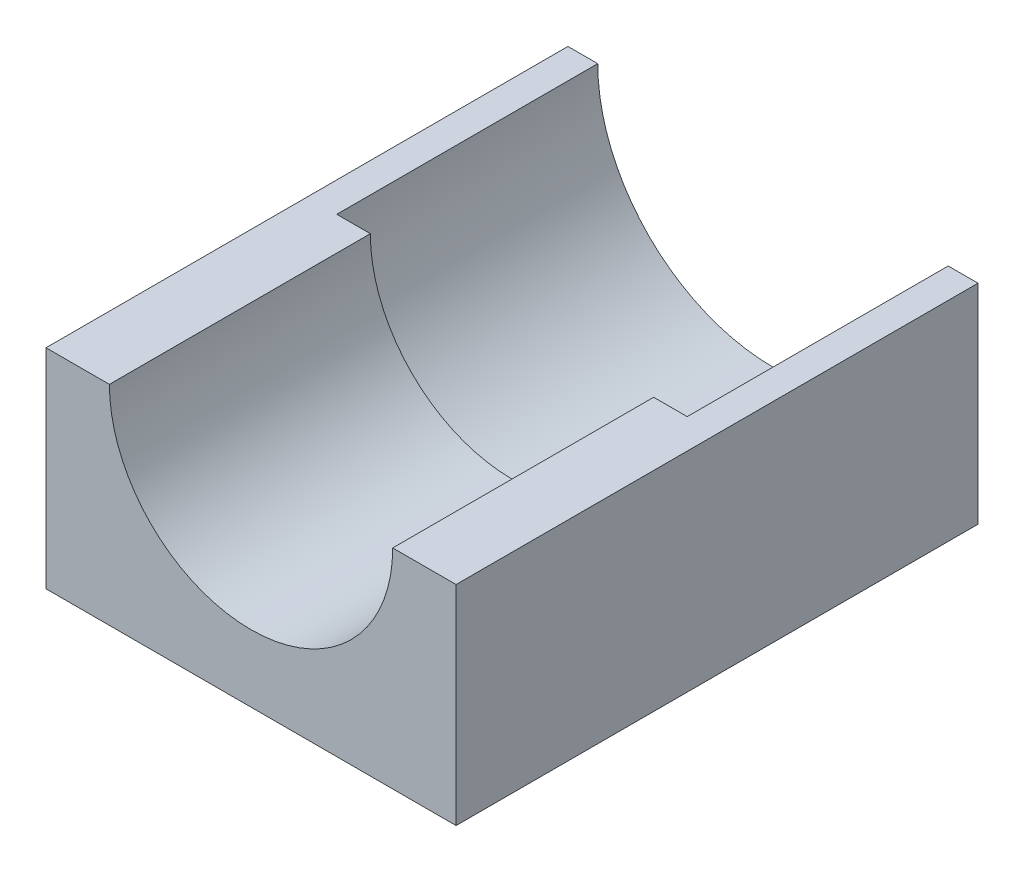
ISO-10303-21;
HEADER;
FILE_DESCRIPTION(('STEP AP214'),'2;1');
FILE_NAME('part.step','',(''),(''),'','','');
FILE_SCHEMA(('AUTOMOTIVE_DESIGN { 1 0 10303 214 1 1 1 1 }'));
ENDSEC;
DATA;
#1=APPLICATION_CONTEXT('core data for automotive mechanical design processes');
#2=APPLICATION_PROTOCOL_DEFINITION('international standard','automotive_design',2000,#1);
#3=PRODUCT_CONTEXT('',#1,'mechanical');
#4=PRODUCT('Part','Part','',(#3));
#5=PRODUCT_RELATED_PRODUCT_CATEGORY('part','',(#4));
#6=PRODUCT_DEFINITION_FORMATION('','',#4);
#7=PRODUCT_DEFINITION_CONTEXT('part definition',#1,'design');
#8=PRODUCT_DEFINITION('design','',#6,#7);
#9=PRODUCT_DEFINITION_SHAPE('','',#8);
#10=(LENGTH_UNIT() NAMED_UNIT(*) SI_UNIT(.MILLI.,.METRE.));
#11=(NAMED_UNIT(*) PLANE_ANGLE_UNIT() SI_UNIT($,.RADIAN.));
#12=(NAMED_UNIT(*) SI_UNIT($,.STERADIAN.) SOLID_ANGLE_UNIT());
#13=UNCERTAINTY_MEASURE_WITH_UNIT(LENGTH_MEASURE(1.E-05),#10,'distance_accuracy_value','');
#14=(GEOMETRIC_REPRESENTATION_CONTEXT(3) GLOBAL_UNCERTAINTY_ASSIGNED_CONTEXT((#13)) GLOBAL_UNIT_ASSIGNED_CONTEXT((#10,
#11,#12)) REPRESENTATION_CONTEXT('',''));
#15=CARTESIAN_POINT('',(0.,0.,0.));
#16=DIRECTION('',(0.,0.,1.));
#17=DIRECTION('',(1.,0.,0.));
#18=AXIS2_PLACEMENT_3D('',#15,#16,#17);
#19=CARTESIAN_POINT('',(72.2489418291473,15.9322548609087,35.));
#20=DIRECTION('',(0.,0.,-1.));
#21=DIRECTION('',(-1.,0.,0.));
#22=AXIS2_PLACEMENT_3D('',#19,#20,#21);
#23=CYLINDRICAL_SURFACE('',#22,23.5);
#24=CARTESIAN_POINT('',(72.2489418291473,15.9322548609087,0.));
#25=DIRECTION('',(0.,0.,-1.));
#26=DIRECTION('',(-1.,0.,0.));
#27=AXIS2_PLACEMENT_3D('',#24,#25,#26);
#28=CIRCLE('',#27,23.5);
#29=CARTESIAN_POINT('',(95.7489418291473,15.9322548609085,0.));
#30=VERTEX_POINT('',#29);
#31=CARTESIAN_POINT('',(48.7489418291473,15.9322548609087,0.));
#32=VERTEX_POINT('',#31);
#33=EDGE_CURVE('E99',#30,#32,#28,.T.);
#34=ORIENTED_EDGE('',*,*,#33,.T.);
#35=DIRECTION('',(0.,0.,-1.));
#36=VECTOR('',#35,1.);
#37=CARTESIAN_POINT('',(48.7489418291473,15.9322548609087,35.));
#38=LINE('',#37,#36);
#39=CARTESIAN_POINT('',(48.7489418291473,15.9322548609087,35.));
#40=VERTEX_POINT('',#39);
#41=EDGE_CURVE('E11',#40,#32,#38,.T.);
#42=ORIENTED_EDGE('',*,*,#41,.F.);
#43=CARTESIAN_POINT('',(72.2489418291473,15.9322548609087,35.));
#44=DIRECTION('',(0.,0.,-1.));
#45=DIRECTION('',(-1.,0.,0.));
#46=AXIS2_PLACEMENT_3D('',#43,#44,#45);
#47=CIRCLE('',#46,23.5);
#48=CARTESIAN_POINT('',(95.7489418291473,15.9322548609085,35.));
#49=VERTEX_POINT('',#48);
#50=EDGE_CURVE('E100',#49,#40,#47,.T.);
#51=ORIENTED_EDGE('',*,*,#50,.F.);
#52=DIRECTION('',(0.,0.,-1.));
#53=VECTOR('',#52,1.);
#54=CARTESIAN_POINT('',(95.7489418291473,15.9322548609085,35.));
#55=LINE('',#54,#53);
#56=EDGE_CURVE('E52',#49,#30,#55,.T.);
#57=ORIENTED_EDGE('',*,*,#56,.T.);
#58=EDGE_LOOP('',(#34,#42,#51,#57));
#59=FACE_BOUND('',#58,.T.);
#60=ADVANCED_FACE('F37',(#59),#23,.F.);
#61=CARTESIAN_POINT('',(48.7489418291473,15.9322548609087,35.));
#62=DIRECTION('',(0.,-1.,0.));
#63=DIRECTION('',(0.,0.,-1.));
#64=AXIS2_PLACEMENT_3D('',#61,#62,#63);
#65=PLANE('',#64);
#66=DIRECTION('',(-1.,0.,0.));
#67=VECTOR('',#66,1.);
#68=CARTESIAN_POINT('',(48.7489418291473,15.9322548609087,0.));
#69=LINE('',#68,#67);
#70=CARTESIAN_POINT('',(44.7489418291473,15.9322548609087,0.));
#71=VERTEX_POINT('',#70);
#72=EDGE_CURVE('E124',#32,#71,#69,.T.);
#73=ORIENTED_EDGE('',*,*,#72,.T.);
#74=DIRECTION('',(0.,0.,-1.));
#75=VECTOR('',#74,1.);
#76=CARTESIAN_POINT('',(44.7489418291473,15.9322548609087,35.));
#77=LINE('',#76,#75);
#78=CARTESIAN_POINT('',(44.7489418291473,15.9322548609087,70.));
#79=VERTEX_POINT('',#78);
#80=EDGE_CURVE('E45',#79,#71,#77,.T.);
#81=ORIENTED_EDGE('',*,*,#80,.F.);
#82=DIRECTION('',(-1.,0.,0.));
#83=VECTOR('',#82,1.);
#84=CARTESIAN_POINT('',(44.7489418291473,15.9322548609087,70.));
#85=LINE('',#84,#83);
#86=CARTESIAN_POINT('',(53.2489418291473,15.9322548609087,70.));
#87=VERTEX_POINT('',#86);
#88=EDGE_CURVE('E151',#87,#79,#85,.T.);
#89=ORIENTED_EDGE('',*,*,#88,.F.);
#90=DIRECTION('',(0.,0.,-1.));
#91=VECTOR('',#90,1.);
#92=CARTESIAN_POINT('',(53.2489418291473,15.9322548609087,70.));
#93=LINE('',#92,#91);
#94=CARTESIAN_POINT('',(53.2489418291473,15.9322548609087,35.));
#95=VERTEX_POINT('',#94);
#96=EDGE_CURVE('E128',#87,#95,#93,.T.);
#97=ORIENTED_EDGE('',*,*,#96,.T.);
#98=DIRECTION('',(-1.,0.,0.));
#99=VECTOR('',#98,1.);
#100=CARTESIAN_POINT('',(44.7489418291473,15.9322548609087,35.));
#101=LINE('',#100,#99);
#102=EDGE_CURVE('E138',#95,#40,#101,.T.);
#103=ORIENTED_EDGE('',*,*,#102,.T.);
#104=ORIENTED_EDGE('',*,*,#41,.T.);
#105=EDGE_LOOP('',(#73,#81,#89,#97,#103,#104));
#106=FACE_BOUND('',#105,.T.);
#107=ADVANCED_FACE('F166',(#106),#65,.F.);
#108=CARTESIAN_POINT('',(44.7489418291473,15.9322548609087,35.));
#109=DIRECTION('',(1.,0.,0.));
#110=DIRECTION('',(0.,0.,-1.));
#111=AXIS2_PLACEMENT_3D('',#108,#109,#110);
#112=PLANE('',#111);
#113=DIRECTION('',(0.,-1.,0.));
#114=VECTOR('',#113,1.);
#115=CARTESIAN_POINT('',(44.7489418291473,15.9322548609087,0.));
#116=LINE('',#115,#114);
#117=CARTESIAN_POINT('',(44.7489418291473,-12.0677451390913,0.));
#118=VERTEX_POINT('',#117);
#119=EDGE_CURVE('E117',#71,#118,#116,.T.);
#120=ORIENTED_EDGE('',*,*,#119,.T.);
#121=DIRECTION('',(0.,0.,-1.));
#122=VECTOR('',#121,1.);
#123=CARTESIAN_POINT('',(44.7489418291473,-12.0677451390913,35.));
#124=LINE('',#123,#122);
#125=CARTESIAN_POINT('',(44.7489418291473,-12.0677451390913,70.));
#126=VERTEX_POINT('',#125);
#127=EDGE_CURVE('E108',#126,#118,#124,.T.);
#128=ORIENTED_EDGE('',*,*,#127,.F.);
#129=DIRECTION('',(0.,-1.,0.));
#130=VECTOR('',#129,1.);
#131=CARTESIAN_POINT('',(44.7489418291473,-12.0677451390913,70.));
#132=LINE('',#131,#130);
#133=EDGE_CURVE('E120',#79,#126,#132,.T.);
#134=ORIENTED_EDGE('',*,*,#133,.F.);
#135=ORIENTED_EDGE('',*,*,#80,.T.);
#136=EDGE_LOOP('',(#120,#128,#134,#135));
#137=FACE_BOUND('',#136,.T.);
#138=ADVANCED_FACE('F115',(#137),#112,.F.);
#139=CARTESIAN_POINT('',(44.7489418291473,-12.0677451390913,35.));
#140=DIRECTION('',(0.,1.,0.));
#141=DIRECTION('',(-1.,0.,0.));
#142=AXIS2_PLACEMENT_3D('',#139,#140,#141);
#143=PLANE('',#142);
#144=DIRECTION('',(1.,0.,0.));
#145=VECTOR('',#144,1.);
#146=CARTESIAN_POINT('',(44.7489418291473,-12.0677451390913,0.));
#147=LINE('',#146,#145);
#148=CARTESIAN_POINT('',(99.7489418291473,-12.0677451390913,0.));
#149=VERTEX_POINT('',#148);
#150=EDGE_CURVE('E88',#118,#149,#147,.T.);
#151=ORIENTED_EDGE('',*,*,#150,.T.);
#152=DIRECTION('',(0.,0.,-1.));
#153=VECTOR('',#152,1.);
#154=CARTESIAN_POINT('',(99.7489418291473,-12.0677451390913,35.));
#155=LINE('',#154,#153);
#156=CARTESIAN_POINT('',(99.7489418291473,-12.0677451390913,70.));
#157=VERTEX_POINT('',#156);
#158=EDGE_CURVE('E83',#157,#149,#155,.T.);
#159=ORIENTED_EDGE('',*,*,#158,.F.);
#160=DIRECTION('',(1.,0.,0.));
#161=VECTOR('',#160,1.);
#162=CARTESIAN_POINT('',(99.7489418291473,-12.0677451390913,70.));
#163=LINE('',#162,#161);
#164=EDGE_CURVE('E147',#126,#157,#163,.T.);
#165=ORIENTED_EDGE('',*,*,#164,.F.);
#166=ORIENTED_EDGE('',*,*,#127,.T.);
#167=EDGE_LOOP('',(#151,#159,#165,#166));
#168=FACE_BOUND('',#167,.T.);
#169=ADVANCED_FACE('F179',(#168),#143,.F.);
#170=CARTESIAN_POINT('',(99.7489418291473,-12.0677451390913,35.));
#171=DIRECTION('',(-1.,0.,0.));
#172=DIRECTION('',(0.,0.,1.));
#173=AXIS2_PLACEMENT_3D('',#170,#171,#172);
#174=PLANE('',#173);
#175=DIRECTION('',(0.,1.,0.));
#176=VECTOR('',#175,1.);
#177=CARTESIAN_POINT('',(99.7489418291473,-12.0677451390913,0.));
#178=LINE('',#177,#176);
#179=CARTESIAN_POINT('',(99.7489418291473,15.9322548609085,0.));
#180=VERTEX_POINT('',#179);
#181=EDGE_CURVE('E75',#149,#180,#178,.T.);
#182=ORIENTED_EDGE('',*,*,#181,.T.);
#183=DIRECTION('',(0.,0.,-1.));
#184=VECTOR('',#183,1.);
#185=CARTESIAN_POINT('',(99.7489418291473,15.9322548609085,35.));
#186=LINE('',#185,#184);
#187=CARTESIAN_POINT('',(99.7489418291473,15.9322548609085,70.));
#188=VERTEX_POINT('',#187);
#189=EDGE_CURVE('E80',#188,#180,#186,.T.);
#190=ORIENTED_EDGE('',*,*,#189,.F.);
#191=DIRECTION('',(0.,1.,0.));
#192=VECTOR('',#191,1.);
#193=CARTESIAN_POINT('',(99.7489418291473,15.9322548609085,70.));
#194=LINE('',#193,#192);
#195=EDGE_CURVE('E145',#157,#188,#194,.T.);
#196=ORIENTED_EDGE('',*,*,#195,.F.);
#197=ORIENTED_EDGE('',*,*,#158,.T.);
#198=EDGE_LOOP('',(#182,#190,#196,#197));
#199=FACE_BOUND('',#198,.T.);
#200=ADVANCED_FACE('F77',(#199),#174,.F.);
#201=CARTESIAN_POINT('',(99.7489418291473,15.9322548609085,35.));
#202=DIRECTION('',(0.,-1.,0.));
#203=DIRECTION('',(1.,0.,0.));
#204=AXIS2_PLACEMENT_3D('',#201,#202,#203);
#205=PLANE('',#204);
#206=DIRECTION('',(-1.,0.,0.));
#207=VECTOR('',#206,1.);
#208=CARTESIAN_POINT('',(99.7489418291473,15.9322548609085,0.));
#209=LINE('',#208,#207);
#210=EDGE_CURVE('E87',#180,#30,#209,.T.);
#211=ORIENTED_EDGE('',*,*,#210,.T.);
#212=ORIENTED_EDGE('',*,*,#56,.F.);
#213=DIRECTION('',(-1.,0.,0.));
#214=VECTOR('',#213,1.);
#215=CARTESIAN_POINT('',(91.2489418291473,15.9322548609087,35.));
#216=LINE('',#215,#214);
#217=CARTESIAN_POINT('',(91.2489418291473,15.9322548609087,35.));
#218=VERTEX_POINT('',#217);
#219=EDGE_CURVE('E135',#49,#218,#216,.T.);
#220=ORIENTED_EDGE('',*,*,#219,.T.);
#221=DIRECTION('',(0.,0.,-1.));
#222=VECTOR('',#221,1.);
#223=CARTESIAN_POINT('',(91.2489418291473,15.9322548609087,70.));
#224=LINE('',#223,#222);
#225=CARTESIAN_POINT('',(91.2489418291473,15.9322548609087,70.));
#226=VERTEX_POINT('',#225);
#227=EDGE_CURVE('E132',#226,#218,#224,.T.);
#228=ORIENTED_EDGE('',*,*,#227,.F.);
#229=DIRECTION('',(-1.,0.,0.));
#230=VECTOR('',#229,1.);
#231=CARTESIAN_POINT('',(91.2489418291473,15.9322548609087,70.));
#232=LINE('',#231,#230);
#233=EDGE_CURVE('E94',#188,#226,#232,.T.);
#234=ORIENTED_EDGE('',*,*,#233,.F.);
#235=ORIENTED_EDGE('',*,*,#189,.T.);
#236=EDGE_LOOP('',(#211,#212,#220,#228,#234,#235));
#237=FACE_BOUND('',#236,.T.);
#238=ADVANCED_FACE('F91',(#237),#205,.F.);
#239=CARTESIAN_POINT('',(72.2489418291473,15.9322548609087,0.));
#240=DIRECTION('',(0.,0.,-1.));
#241=DIRECTION('',(-1.,0.,0.));
#242=AXIS2_PLACEMENT_3D('',#239,#240,#241);
#243=PLANE('',#242);
#244=ORIENTED_EDGE('',*,*,#33,.F.);
#245=ORIENTED_EDGE('',*,*,#210,.F.);
#246=ORIENTED_EDGE('',*,*,#181,.F.);
#247=ORIENTED_EDGE('',*,*,#150,.F.);
#248=ORIENTED_EDGE('',*,*,#119,.F.);
#249=ORIENTED_EDGE('',*,*,#72,.F.);
#250=EDGE_LOOP('',(#244,#245,#246,#247,#248,#249));
#251=FACE_BOUND('',#250,.T.);
#252=ADVANCED_FACE('F97',(#251),#243,.T.);
#253=CARTESIAN_POINT('',(72.2489418291473,15.9322548609087,35.));
#254=DIRECTION('',(0.,0.,-1.));
#255=DIRECTION('',(-1.,0.,0.));
#256=AXIS2_PLACEMENT_3D('',#253,#254,#255);
#257=PLANE('',#256);
#258=ORIENTED_EDGE('',*,*,#219,.F.);
#259=ORIENTED_EDGE('',*,*,#50,.T.);
#260=ORIENTED_EDGE('',*,*,#102,.F.);
#261=CARTESIAN_POINT('',(72.2489418291473,15.9322548609087,35.));
#262=DIRECTION('',(0.,0.,-1.));
#263=DIRECTION('',(-1.,0.,0.));
#264=AXIS2_PLACEMENT_3D('',#261,#262,#263);
#265=CIRCLE('',#264,19.);
#266=EDGE_CURVE('E141',#218,#95,#265,.T.);
#267=ORIENTED_EDGE('',*,*,#266,.F.);
#268=EDGE_LOOP('',(#258,#259,#260,#267));
#269=FACE_BOUND('',#268,.T.);
#270=ADVANCED_FACE('F195',(#269),#257,.T.);
#271=CARTESIAN_POINT('',(72.2489418291473,15.9322548609087,70.));
#272=DIRECTION('',(0.,0.,-1.));
#273=DIRECTION('',(-1.,0.,0.));
#274=AXIS2_PLACEMENT_3D('',#271,#272,#273);
#275=CYLINDRICAL_SURFACE('',#274,19.);
#276=ORIENTED_EDGE('',*,*,#266,.T.);
#277=ORIENTED_EDGE('',*,*,#96,.F.);
#278=CARTESIAN_POINT('',(72.2489418291473,15.9322548609087,70.));
#279=DIRECTION('',(0.,0.,-1.));
#280=DIRECTION('',(-1.,0.,0.));
#281=AXIS2_PLACEMENT_3D('',#278,#279,#280);
#282=CIRCLE('',#281,19.);
#283=EDGE_CURVE('E137',#226,#87,#282,.T.);
#284=ORIENTED_EDGE('',*,*,#283,.F.);
#285=ORIENTED_EDGE('',*,*,#227,.T.);
#286=EDGE_LOOP('',(#276,#277,#284,#285));
#287=FACE_BOUND('',#286,.T.);
#288=ADVANCED_FACE('F163',(#287),#275,.F.);
#289=CARTESIAN_POINT('',(72.2489418291473,15.9322548609087,70.));
#290=DIRECTION('',(0.,0.,-1.));
#291=DIRECTION('',(-1.,0.,0.));
#292=AXIS2_PLACEMENT_3D('',#289,#290,#291);
#293=PLANE('',#292);
#294=ORIENTED_EDGE('',*,*,#283,.T.);
#295=ORIENTED_EDGE('',*,*,#88,.T.);
#296=ORIENTED_EDGE('',*,*,#133,.T.);
#297=ORIENTED_EDGE('',*,*,#164,.T.);
#298=ORIENTED_EDGE('',*,*,#195,.T.);
#299=ORIENTED_EDGE('',*,*,#233,.T.);
#300=EDGE_LOOP('',(#294,#295,#296,#297,#298,#299));
#301=FACE_BOUND('',#300,.T.);
#302=ADVANCED_FACE('F158',(#301),#293,.F.);
#303=CLOSED_SHELL('',(#60,#107,#138,#169,#200,#238,#252,#270,#288,#302));
#304=MANIFOLD_SOLID_BREP('B2',#303);
#305=ADVANCED_BREP_SHAPE_REPRESENTATION('',(#18,#304),#14);
#306=SHAPE_DEFINITION_REPRESENTATION(#9,#305);
ENDSEC;
END-ISO-10303-21;
